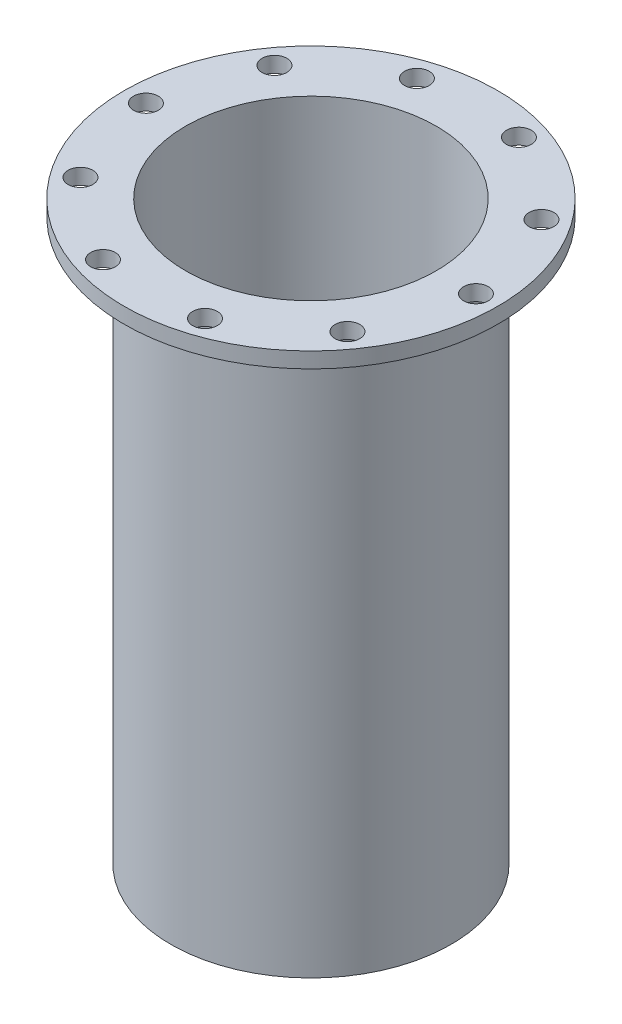
ISO-10303-21;
HEADER;
FILE_DESCRIPTION(('STEP AP214'),'2;1');
FILE_NAME('part.step','',(''),(''),'','','');
FILE_SCHEMA(('AUTOMOTIVE_DESIGN { 1 0 10303 214 1 1 1 1 }'));
ENDSEC;
DATA;
#1=APPLICATION_CONTEXT('core data for automotive mechanical design processes');
#2=APPLICATION_PROTOCOL_DEFINITION('international standard','automotive_design',2000,#1);
#3=PRODUCT_CONTEXT('',#1,'mechanical');
#4=PRODUCT('Part','Part','',(#3));
#5=PRODUCT_RELATED_PRODUCT_CATEGORY('part','',(#4));
#6=PRODUCT_DEFINITION_FORMATION('','',#4);
#7=PRODUCT_DEFINITION_CONTEXT('part definition',#1,'design');
#8=PRODUCT_DEFINITION('design','',#6,#7);
#9=PRODUCT_DEFINITION_SHAPE('','',#8);
#10=(LENGTH_UNIT() NAMED_UNIT(*) SI_UNIT(.MILLI.,.METRE.));
#11=(NAMED_UNIT(*) PLANE_ANGLE_UNIT() SI_UNIT($,.RADIAN.));
#12=(NAMED_UNIT(*) SI_UNIT($,.STERADIAN.) SOLID_ANGLE_UNIT());
#13=UNCERTAINTY_MEASURE_WITH_UNIT(LENGTH_MEASURE(1.E-05),#10,'distance_accuracy_value','');
#14=(GEOMETRIC_REPRESENTATION_CONTEXT(3) GLOBAL_UNCERTAINTY_ASSIGNED_CONTEXT((#13)) GLOBAL_UNIT_ASSIGNED_CONTEXT((#10,
#11,#12)) REPRESENTATION_CONTEXT('',''));
#15=CARTESIAN_POINT('',(0.,0.,0.));
#16=DIRECTION('',(0.,0.,1.));
#17=DIRECTION('',(1.,0.,0.));
#18=AXIS2_PLACEMENT_3D('',#15,#16,#17);
#19=CARTESIAN_POINT('',(76.2,1.25806636316965E-13,0.));
#20=DIRECTION('',(0.,-1.,0.));
#21=DIRECTION('',(1.,0.,0.));
#22=AXIS2_PLACEMENT_3D('',#19,#20,#21);
#23=PLANE('',#22);
#24=CARTESIAN_POINT('',(54.4549338913782,5.66939445869481E-13,39.5638253318057));
#25=DIRECTION('',(0.,1.,0.));
#26=DIRECTION('',(0.,0.,1.));
#27=AXIS2_PLACEMENT_3D('',#24,#25,#26);
#28=CIRCLE('',#27,5.04189999999997);
#29=CARTESIAN_POINT('',(54.4549338913782,5.66939445869481E-13,44.6057253318056));
#30=VERTEX_POINT('',#29);
#31=EDGE_CURVE('E87',#30,#30,#28,.T.);
#32=ORIENTED_EDGE('',*,*,#31,.F.);
#33=EDGE_LOOP('',(#32));
#34=FACE_BOUND('',#33,.T.);
#35=CARTESIAN_POINT('',(20.7999338913784,2.16470374895981E-13,64.0156141118266));
#36=DIRECTION('',(0.,1.,0.));
#37=DIRECTION('',(0.,0.,1.));
#38=AXIS2_PLACEMENT_3D('',#35,#36,#37);
#39=CIRCLE('',#38,5.04189999999997);
#40=CARTESIAN_POINT('',(20.7999338913784,2.16470374895981E-13,69.0575141118265));
#41=VERTEX_POINT('',#40);
#42=EDGE_CURVE('E77',#41,#41,#39,.T.);
#43=ORIENTED_EDGE('',*,*,#42,.F.);
#44=EDGE_LOOP('',(#43));
#45=FACE_BOUND('',#44,.T.);
#46=CARTESIAN_POINT('',(-20.7999338913771,-2.16733220838468E-13,64.015614111827));
#47=DIRECTION('',(0.,1.,0.));
#48=DIRECTION('',(0.,0.,1.));
#49=AXIS2_PLACEMENT_3D('',#46,#47,#48);
#50=CIRCLE('',#49,5.04189999999997);
#51=CARTESIAN_POINT('',(-20.7999338913771,-2.16733220838468E-13,69.0575141118269));
#52=VERTEX_POINT('',#51);
#53=EDGE_CURVE('E74',#52,#52,#50,.T.);
#54=ORIENTED_EDGE('',*,*,#53,.F.);
#55=EDGE_LOOP('',(#54));
#56=FACE_BOUND('',#55,.T.);
#57=CARTESIAN_POINT('',(-54.4549338913774,-5.67202291811973E-13,39.5638253318068));
#58=DIRECTION('',(0.,1.,0.));
#59=DIRECTION('',(0.,0.,1.));
#60=AXIS2_PLACEMENT_3D('',#57,#58,#59);
#61=CIRCLE('',#60,5.04189999999997);
#62=CARTESIAN_POINT('',(-54.4549338913774,-5.67202291811973E-13,44.6057253318068));
#63=VERTEX_POINT('',#62);
#64=EDGE_CURVE('E71',#63,#63,#61,.T.);
#65=ORIENTED_EDGE('',*,*,#64,.F.);
#66=EDGE_LOOP('',(#65));
#67=FACE_BOUND('',#66,.T.);
#68=CARTESIAN_POINT('',(-67.31,-7.01069564918256E-13,0.));
#69=DIRECTION('',(0.,1.,0.));
#70=DIRECTION('',(0.,0.,1.));
#71=AXIS2_PLACEMENT_3D('',#68,#69,#70);
#72=CIRCLE('',#71,5.04189999999997);
#73=CARTESIAN_POINT('',(-67.31,-7.01069564918256E-13,5.04189999999997));
#74=VERTEX_POINT('',#73);
#75=EDGE_CURVE('E70',#74,#74,#72,.T.);
#76=ORIENTED_EDGE('',*,*,#75,.F.);
#77=EDGE_LOOP('',(#76));
#78=FACE_BOUND('',#77,.T.);
#79=CARTESIAN_POINT('',(-54.4549338913779,-5.67202291811979E-13,-39.5638253318061));
#80=DIRECTION('',(0.,1.,0.));
#81=DIRECTION('',(0.,0.,1.));
#82=AXIS2_PLACEMENT_3D('',#79,#80,#81);
#83=CIRCLE('',#82,5.04189999999997);
#84=CARTESIAN_POINT('',(-54.4549338913779,-5.67202291811979E-13,-34.5219253318061));
#85=VERTEX_POINT('',#84);
#86=EDGE_CURVE('E66',#85,#85,#83,.T.);
#87=ORIENTED_EDGE('',*,*,#86,.F.);
#88=EDGE_LOOP('',(#87));
#89=FACE_BOUND('',#88,.T.);
#90=CARTESIAN_POINT('',(-20.799933891378,-2.16733220838477E-13,-64.0156141118267));
#91=DIRECTION('',(0.,1.,0.));
#92=DIRECTION('',(0.,0.,1.));
#93=AXIS2_PLACEMENT_3D('',#90,#91,#92);
#94=CIRCLE('',#93,5.04189999999997);
#95=CARTESIAN_POINT('',(-20.799933891378,-2.16733220838477E-13,-58.9737141118267));
#96=VERTEX_POINT('',#95);
#97=EDGE_CURVE('E65',#96,#96,#94,.T.);
#98=ORIENTED_EDGE('',*,*,#97,.F.);
#99=EDGE_LOOP('',(#98));
#100=FACE_BOUND('',#99,.T.);
#101=CARTESIAN_POINT('',(20.7999338913775,2.16470374895971E-13,-64.0156141118268));
#102=DIRECTION('',(0.,1.,0.));
#103=DIRECTION('',(0.,0.,1.));
#104=AXIS2_PLACEMENT_3D('',#101,#102,#103);
#105=CIRCLE('',#104,5.04189999999997);
#106=CARTESIAN_POINT('',(20.7999338913775,2.16470374895971E-13,-58.9737141118269));
#107=VERTEX_POINT('',#106);
#108=EDGE_CURVE('E104',#107,#107,#105,.T.);
#109=ORIENTED_EDGE('',*,*,#108,.F.);
#110=EDGE_LOOP('',(#109));
#111=FACE_BOUND('',#110,.T.);
#112=CARTESIAN_POINT('',(54.4549338913777,5.66939445869475E-13,-39.5638253318064));
#113=DIRECTION('',(0.,1.,0.));
#114=DIRECTION('',(0.,0.,1.));
#115=AXIS2_PLACEMENT_3D('',#112,#113,#114);
#116=CIRCLE('',#115,5.04189999999997);
#117=CARTESIAN_POINT('',(54.4549338913777,5.66939445869475E-13,-34.5219253318065));
#118=VERTEX_POINT('',#117);
#119=EDGE_CURVE('E61',#118,#118,#116,.T.);
#120=ORIENTED_EDGE('',*,*,#119,.F.);
#121=EDGE_LOOP('',(#120));
#122=FACE_BOUND('',#121,.T.);
#123=CARTESIAN_POINT('',(67.31,7.00806718975755E-13,0.));
#124=DIRECTION('',(0.,1.,0.));
#125=DIRECTION('',(0.,0.,1.));
#126=AXIS2_PLACEMENT_3D('',#123,#124,#125);
#127=CIRCLE('',#126,5.04189999999997);
#128=CARTESIAN_POINT('',(67.31,7.00806718975755E-13,5.04189999999997));
#129=VERTEX_POINT('',#128);
#130=EDGE_CURVE('E57',#129,#129,#127,.T.);
#131=ORIENTED_EDGE('',*,*,#130,.F.);
#132=EDGE_LOOP('',(#131));
#133=FACE_BOUND('',#132,.T.);
#134=CARTESIAN_POINT('',(0.,-5.38710126497475E-13,0.));
#135=DIRECTION('',(0.,1.,0.));
#136=DIRECTION('',(-1.,0.,0.));
#137=AXIS2_PLACEMENT_3D('',#134,#135,#136);
#138=CIRCLE('',#137,51.1302);
#139=CARTESIAN_POINT('',(-51.1302,-1.07115860941797E-12,0.));
#140=VERTEX_POINT('',#139);
#141=EDGE_CURVE('E10',#140,#140,#138,.T.);
#142=ORIENTED_EDGE('',*,*,#141,.F.);
#143=EDGE_LOOP('',(#142));
#144=FACE_BOUND('',#143,.T.);
#145=CARTESIAN_POINT('',(0.,-7.96706356220305E-13,0.));
#146=DIRECTION('',(0.,1.,0.));
#147=DIRECTION('',(-1.,0.,0.));
#148=AXIS2_PLACEMENT_3D('',#145,#146,#147);
#149=CIRCLE('',#148,76.2);
#150=CARTESIAN_POINT('',(-76.2,-1.59022123389616E-12,0.));
#151=VERTEX_POINT('',#150);
#152=EDGE_CURVE('E56',#151,#151,#149,.T.);
#153=ORIENTED_EDGE('',*,*,#152,.T.);
#154=EDGE_LOOP('',(#153));
#155=FACE_BOUND('',#154,.T.);
#156=ADVANCED_FACE('F37',(#34,#45,#56,#67,#78,#89,#100,#111,#122,#133,#144,#155),#23,.F.);
#157=CARTESIAN_POINT('',(0.,0.,0.));
#158=DIRECTION('',(0.,1.,0.));
#159=DIRECTION('',(-1.,0.,0.));
#160=AXIS2_PLACEMENT_3D('',#157,#158,#159);
#161=CYLINDRICAL_SURFACE('',#160,51.1301999999989);
#162=CARTESIAN_POINT('',(2.22845428147304E-12,-213.995000000001,0.));
#163=DIRECTION('',(0.,1.,0.));
#164=DIRECTION('',(-1.,0.,0.));
#165=AXIS2_PLACEMENT_3D('',#162,#163,#164);
#166=CIRCLE('',#165,51.1301999999978);
#167=CARTESIAN_POINT('',(-51.1301999999956,-213.995000000002,0.));
#168=VERTEX_POINT('',#167);
#169=EDGE_CURVE('E44',#168,#168,#166,.T.);
#170=ORIENTED_EDGE('',*,*,#169,.F.);
#171=EDGE_LOOP('',(#170));
#172=FACE_BOUND('',#171,.T.);
#173=ORIENTED_EDGE('',*,*,#141,.T.);
#174=EDGE_LOOP('',(#173));
#175=FACE_BOUND('',#174,.T.);
#176=ADVANCED_FACE('F141',(#172,#175),#161,.F.);
#177=CARTESIAN_POINT('',(51.1302,-213.995000000001,0.));
#178=DIRECTION('',(0.,1.,0.));
#179=DIRECTION('',(-1.,0.,0.));
#180=AXIS2_PLACEMENT_3D('',#177,#178,#179);
#181=PLANE('',#180);
#182=CARTESIAN_POINT('',(2.22845428147304E-12,-213.995000000001,0.));
#183=DIRECTION('',(0.,1.,0.));
#184=DIRECTION('',(-1.,0.,0.));
#185=AXIS2_PLACEMENT_3D('',#182,#183,#184);
#186=CIRCLE('',#185,53.6701999999978);
#187=CARTESIAN_POINT('',(-53.6701999999956,-213.995000000002,0.));
#188=VERTEX_POINT('',#187);
#189=EDGE_CURVE('E49',#188,#188,#186,.T.);
#190=ORIENTED_EDGE('',*,*,#189,.F.);
#191=EDGE_LOOP('',(#190));
#192=FACE_BOUND('',#191,.T.);
#193=ORIENTED_EDGE('',*,*,#169,.T.);
#194=EDGE_LOOP('',(#193));
#195=FACE_BOUND('',#194,.T.);
#196=ADVANCED_FACE('F138',(#192,#195),#181,.F.);
#197=CARTESIAN_POINT('',(0.,0.,0.));
#198=DIRECTION('',(0.,1.,0.));
#199=DIRECTION('',(-1.,0.,0.));
#200=AXIS2_PLACEMENT_3D('',#197,#198,#199);
#201=CYLINDRICAL_SURFACE('',#200,53.6701999999978);
#202=CARTESIAN_POINT('',(2.26019487658007E-12,-217.043000000001,0.));
#203=DIRECTION('',(0.,1.,0.));
#204=DIRECTION('',(-1.,0.,0.));
#205=AXIS2_PLACEMENT_3D('',#202,#203,#204);
#206=CIRCLE('',#205,53.6701999999978);
#207=CARTESIAN_POINT('',(-53.6701999999955,-217.043000000002,0.));
#208=VERTEX_POINT('',#207);
#209=EDGE_CURVE('E131',#208,#208,#206,.T.);
#210=ORIENTED_EDGE('',*,*,#209,.F.);
#211=EDGE_LOOP('',(#210));
#212=FACE_BOUND('',#211,.T.);
#213=ORIENTED_EDGE('',*,*,#189,.T.);
#214=EDGE_LOOP('',(#213));
#215=FACE_BOUND('',#214,.T.);
#216=ADVANCED_FACE('F136',(#212,#215),#201,.F.);
#217=CARTESIAN_POINT('',(53.6702,-217.043000000001,0.));
#218=DIRECTION('',(0.,-1.,0.));
#219=DIRECTION('',(1.,0.,0.));
#220=AXIS2_PLACEMENT_3D('',#217,#218,#219);
#221=PLANE('',#220);
#222=CARTESIAN_POINT('',(2.26019487658007E-12,-217.043000000001,0.));
#223=DIRECTION('',(0.,1.,0.));
#224=DIRECTION('',(-1.,0.,0.));
#225=AXIS2_PLACEMENT_3D('',#222,#223,#224);
#226=CIRCLE('',#225,51.1301999999978);
#227=CARTESIAN_POINT('',(-51.1301999999955,-217.043000000002,0.));
#228=VERTEX_POINT('',#227);
#229=EDGE_CURVE('E128',#228,#228,#226,.T.);
#230=ORIENTED_EDGE('',*,*,#229,.F.);
#231=EDGE_LOOP('',(#230));
#232=FACE_BOUND('',#231,.T.);
#233=ORIENTED_EDGE('',*,*,#209,.T.);
#234=EDGE_LOOP('',(#233));
#235=FACE_BOUND('',#234,.T.);
#236=ADVANCED_FACE('F153',(#232,#235),#221,.F.);
#237=CARTESIAN_POINT('',(0.,0.,0.));
#238=DIRECTION('',(0.,1.,0.));
#239=DIRECTION('',(-1.,0.,0.));
#240=AXIS2_PLACEMENT_3D('',#237,#238,#239);
#241=CYLINDRICAL_SURFACE('',#240,51.1301999999977);
#242=CARTESIAN_POINT('',(2.44667087283389E-12,-234.950000000001,0.));
#243=DIRECTION('',(0.,1.,0.));
#244=DIRECTION('',(-1.,0.,0.));
#245=AXIS2_PLACEMENT_3D('',#242,#243,#244);
#246=CIRCLE('',#245,51.1301999999976);
#247=CARTESIAN_POINT('',(-51.1301999999951,-234.950000000001,0.));
#248=VERTEX_POINT('',#247);
#249=EDGE_CURVE('E125',#248,#248,#246,.T.);
#250=ORIENTED_EDGE('',*,*,#249,.F.);
#251=EDGE_LOOP('',(#250));
#252=FACE_BOUND('',#251,.T.);
#253=ORIENTED_EDGE('',*,*,#229,.T.);
#254=EDGE_LOOP('',(#253));
#255=FACE_BOUND('',#254,.T.);
#256=ADVANCED_FACE('F157',(#252,#255),#241,.F.);
#257=CARTESIAN_POINT('',(51.1302,-234.95,0.));
#258=DIRECTION('',(0.,1.,0.));
#259=DIRECTION('',(-1.,0.,0.));
#260=AXIS2_PLACEMENT_3D('',#257,#258,#259);
#261=PLANE('',#260);
#262=CARTESIAN_POINT('',(2.44667087283389E-12,-234.950000000001,0.));
#263=DIRECTION('',(0.,1.,0.));
#264=DIRECTION('',(-1.,0.,0.));
#265=AXIS2_PLACEMENT_3D('',#262,#263,#264);
#266=CIRCLE('',#265,57.1499999999976);
#267=CARTESIAN_POINT('',(-57.1499999999951,-234.950000000001,0.));
#268=VERTEX_POINT('',#267);
#269=EDGE_CURVE('E122',#268,#268,#266,.T.);
#270=ORIENTED_EDGE('',*,*,#269,.F.);
#271=EDGE_LOOP('',(#270));
#272=FACE_BOUND('',#271,.T.);
#273=ORIENTED_EDGE('',*,*,#249,.T.);
#274=EDGE_LOOP('',(#273));
#275=FACE_BOUND('',#274,.T.);
#276=ADVANCED_FACE('F161',(#272,#275),#261,.F.);
#277=CARTESIAN_POINT('',(0.,0.,0.));
#278=DIRECTION('',(0.,1.,0.));
#279=DIRECTION('',(-1.,0.,0.));
#280=AXIS2_PLACEMENT_3D('',#277,#278,#279);
#281=CYLINDRICAL_SURFACE('',#280,57.1499999999988);
#282=CARTESIAN_POINT('',(0.,-6.3500000000006,0.));
#283=DIRECTION('',(0.,1.,0.));
#284=DIRECTION('',(-1.,0.,0.));
#285=AXIS2_PLACEMENT_3D('',#282,#283,#284);
#286=CIRCLE('',#285,57.1499999999999);
#287=CARTESIAN_POINT('',(-57.1499999999999,-6.35000000000119,0.));
#288=VERTEX_POINT('',#287);
#289=EDGE_CURVE('E119',#288,#288,#286,.T.);
#290=ORIENTED_EDGE('',*,*,#289,.F.);
#291=EDGE_LOOP('',(#290));
#292=FACE_BOUND('',#291,.T.);
#293=ORIENTED_EDGE('',*,*,#269,.T.);
#294=EDGE_LOOP('',(#293));
#295=FACE_BOUND('',#294,.T.);
#296=ADVANCED_FACE('F165',(#292,#295),#281,.T.);
#297=CARTESIAN_POINT('',(57.15,-6.3500000000001,0.));
#298=DIRECTION('',(0.,1.,0.));
#299=DIRECTION('',(-1.,0.,0.));
#300=AXIS2_PLACEMENT_3D('',#297,#298,#299);
#301=PLANE('',#300);
#302=CARTESIAN_POINT('',(54.4549338913782,-6.35000000000013,39.5638253318057));
#303=DIRECTION('',(0.,1.,0.));
#304=DIRECTION('',(-1.,0.,0.));
#305=AXIS2_PLACEMENT_3D('',#302,#303,#304);
#306=CIRCLE('',#305,5.04189999999995);
#307=CARTESIAN_POINT('',(49.4130338913783,-6.35000000000018,39.5638253318057));
#308=VERTEX_POINT('',#307);
#309=EDGE_CURVE('E40',#308,#308,#306,.T.);
#310=ORIENTED_EDGE('',*,*,#309,.T.);
#311=EDGE_LOOP('',(#310));
#312=FACE_BOUND('',#311,.T.);
#313=CARTESIAN_POINT('',(20.7999338913784,-6.35000000000048,64.0156141118266));
#314=DIRECTION('',(0.,1.,0.));
#315=DIRECTION('',(-1.,0.,0.));
#316=AXIS2_PLACEMENT_3D('',#313,#314,#315);
#317=CIRCLE('',#316,5.04189999999995);
#318=CARTESIAN_POINT('',(15.7580338913785,-6.35000000000053,64.0156141118266));
#319=VERTEX_POINT('',#318);
#320=EDGE_CURVE('E75',#319,#319,#317,.T.);
#321=ORIENTED_EDGE('',*,*,#320,.T.);
#322=EDGE_LOOP('',(#321));
#323=FACE_BOUND('',#322,.T.);
#324=CARTESIAN_POINT('',(-20.7999338913771,-6.35000000000091,64.015614111827));
#325=DIRECTION('',(0.,1.,0.));
#326=DIRECTION('',(-1.,0.,0.));
#327=AXIS2_PLACEMENT_3D('',#324,#325,#326);
#328=CIRCLE('',#327,5.04189999999995);
#329=CARTESIAN_POINT('',(-25.841833891377,-6.35000000000097,64.015614111827));
#330=VERTEX_POINT('',#329);
#331=EDGE_CURVE('E72',#330,#330,#328,.T.);
#332=ORIENTED_EDGE('',*,*,#331,.T.);
#333=EDGE_LOOP('',(#332));
#334=FACE_BOUND('',#333,.T.);
#335=CARTESIAN_POINT('',(-54.4549338913774,-6.35000000000126,39.5638253318068));
#336=DIRECTION('',(0.,1.,0.));
#337=DIRECTION('',(-1.,0.,0.));
#338=AXIS2_PLACEMENT_3D('',#335,#336,#337);
#339=CIRCLE('',#338,5.04189999999995);
#340=CARTESIAN_POINT('',(-59.4968338913773,-6.35000000000132,39.5638253318068));
#341=VERTEX_POINT('',#340);
#342=EDGE_CURVE('E67',#341,#341,#339,.T.);
#343=ORIENTED_EDGE('',*,*,#342,.T.);
#344=EDGE_LOOP('',(#343));
#345=FACE_BOUND('',#344,.T.);
#346=CARTESIAN_POINT('',(-67.31,-6.3500000000014,0.));
#347=DIRECTION('',(0.,1.,0.));
#348=DIRECTION('',(-1.,0.,0.));
#349=AXIS2_PLACEMENT_3D('',#346,#347,#348);
#350=CIRCLE('',#349,5.04189999999995);
#351=CARTESIAN_POINT('',(-72.3518999999999,-6.35000000000145,0.));
#352=VERTEX_POINT('',#351);
#353=EDGE_CURVE('E94',#352,#352,#350,.T.);
#354=ORIENTED_EDGE('',*,*,#353,.T.);
#355=EDGE_LOOP('',(#354));
#356=FACE_BOUND('',#355,.T.);
#357=CARTESIAN_POINT('',(-54.4549338913779,-6.35000000000126,-39.5638253318061));
#358=DIRECTION('',(0.,1.,0.));
#359=DIRECTION('',(-1.,0.,0.));
#360=AXIS2_PLACEMENT_3D('',#357,#358,#359);
#361=CIRCLE('',#360,5.04189999999995);
#362=CARTESIAN_POINT('',(-59.4968338913779,-6.35000000000132,-39.5638253318061));
#363=VERTEX_POINT('',#362);
#364=EDGE_CURVE('E62',#363,#363,#361,.T.);
#365=ORIENTED_EDGE('',*,*,#364,.T.);
#366=EDGE_LOOP('',(#365));
#367=FACE_BOUND('',#366,.T.);
#368=CARTESIAN_POINT('',(-20.799933891378,-6.35000000000091,-64.0156141118267));
#369=DIRECTION('',(0.,1.,0.));
#370=DIRECTION('',(-1.,0.,0.));
#371=AXIS2_PLACEMENT_3D('',#368,#369,#370);
#372=CIRCLE('',#371,5.04189999999995);
#373=CARTESIAN_POINT('',(-25.8418338913779,-6.35000000000097,-64.0156141118267));
#374=VERTEX_POINT('',#373);
#375=EDGE_CURVE('E101',#374,#374,#372,.T.);
#376=ORIENTED_EDGE('',*,*,#375,.T.);
#377=EDGE_LOOP('',(#376));
#378=FACE_BOUND('',#377,.T.);
#379=CARTESIAN_POINT('',(20.7999338913775,-6.35000000000048,-64.0156141118268));
#380=DIRECTION('',(0.,1.,0.));
#381=DIRECTION('',(-1.,0.,0.));
#382=AXIS2_PLACEMENT_3D('',#379,#380,#381);
#383=CIRCLE('',#382,5.04189999999995);
#384=CARTESIAN_POINT('',(15.7580338913776,-6.35000000000053,-64.0156141118268));
#385=VERTEX_POINT('',#384);
#386=EDGE_CURVE('E107',#385,#385,#383,.T.);
#387=ORIENTED_EDGE('',*,*,#386,.T.);
#388=EDGE_LOOP('',(#387));
#389=FACE_BOUND('',#388,.T.);
#390=CARTESIAN_POINT('',(54.4549338913777,-6.35000000000013,-39.5638253318064));
#391=DIRECTION('',(0.,1.,0.));
#392=DIRECTION('',(-1.,0.,0.));
#393=AXIS2_PLACEMENT_3D('',#390,#391,#392);
#394=CIRCLE('',#393,5.04189999999995);
#395=CARTESIAN_POINT('',(49.4130338913777,-6.35000000000018,-39.5638253318064));
#396=VERTEX_POINT('',#395);
#397=EDGE_CURVE('E58',#396,#396,#394,.T.);
#398=ORIENTED_EDGE('',*,*,#397,.T.);
#399=EDGE_LOOP('',(#398));
#400=FACE_BOUND('',#399,.T.);
#401=CARTESIAN_POINT('',(67.31,-6.35,0.));
#402=DIRECTION('',(0.,1.,0.));
#403=DIRECTION('',(-1.,0.,0.));
#404=AXIS2_PLACEMENT_3D('',#401,#402,#403);
#405=CIRCLE('',#404,5.04189999999996);
#406=CARTESIAN_POINT('',(62.2681,-6.35000000000005,0.));
#407=VERTEX_POINT('',#406);
#408=EDGE_CURVE('E53',#407,#407,#405,.T.);
#409=ORIENTED_EDGE('',*,*,#408,.T.);
#410=EDGE_LOOP('',(#409));
#411=FACE_BOUND('',#410,.T.);
#412=CARTESIAN_POINT('',(0.,-6.3500000000008,0.));
#413=DIRECTION('',(0.,1.,0.));
#414=DIRECTION('',(-1.,0.,0.));
#415=AXIS2_PLACEMENT_3D('',#412,#413,#414);
#416=CIRCLE('',#415,76.1999999999999);
#417=CARTESIAN_POINT('',(-76.1999999999999,-6.35000000000159,0.));
#418=VERTEX_POINT('',#417);
#419=EDGE_CURVE('E116',#418,#418,#416,.T.);
#420=ORIENTED_EDGE('',*,*,#419,.F.);
#421=EDGE_LOOP('',(#420));
#422=FACE_BOUND('',#421,.T.);
#423=ORIENTED_EDGE('',*,*,#289,.T.);
#424=EDGE_LOOP('',(#423));
#425=FACE_BOUND('',#424,.T.);
#426=ADVANCED_FACE('F169',(#312,#323,#334,#345,#356,#367,#378,#389,#400,#411,#422,#425),#301,.F.);
#427=CARTESIAN_POINT('',(0.,0.,0.));
#428=DIRECTION('',(0.,1.,0.));
#429=DIRECTION('',(-1.,0.,0.));
#430=AXIS2_PLACEMENT_3D('',#427,#428,#429);
#431=CYLINDRICAL_SURFACE('',#430,76.2);
#432=ORIENTED_EDGE('',*,*,#152,.F.);
#433=EDGE_LOOP('',(#432));
#434=FACE_BOUND('',#433,.T.);
#435=ORIENTED_EDGE('',*,*,#419,.T.);
#436=EDGE_LOOP('',(#435));
#437=FACE_BOUND('',#436,.T.);
#438=ADVANCED_FACE('F173',(#434,#437),#431,.T.);
#439=CARTESIAN_POINT('',(67.31,7.00938141947005E-13,0.));
#440=DIRECTION('',(0.,1.,0.));
#441=DIRECTION('',(0.,0.,1.));
#442=AXIS2_PLACEMENT_3D('',#439,#440,#441);
#443=CYLINDRICAL_SURFACE('',#442,5.04189999999996);
#444=ORIENTED_EDGE('',*,*,#130,.T.);
#445=EDGE_LOOP('',(#444));
#446=FACE_BOUND('',#445,.T.);
#447=ORIENTED_EDGE('',*,*,#408,.F.);
#448=EDGE_LOOP('',(#447));
#449=FACE_BOUND('',#448,.T.);
#450=ADVANCED_FACE('F177',(#446,#449),#443,.F.);
#451=CARTESIAN_POINT('',(54.4549338913777,5.67070868840726E-13,-39.5638253318064));
#452=DIRECTION('',(0.,1.,0.));
#453=DIRECTION('',(0.,0.,1.));
#454=AXIS2_PLACEMENT_3D('',#451,#452,#453);
#455=CYLINDRICAL_SURFACE('',#454,5.04189999999995);
#456=ORIENTED_EDGE('',*,*,#119,.T.);
#457=EDGE_LOOP('',(#456));
#458=FACE_BOUND('',#457,.T.);
#459=ORIENTED_EDGE('',*,*,#397,.F.);
#460=EDGE_LOOP('',(#459));
#461=FACE_BOUND('',#460,.T.);
#462=ADVANCED_FACE('F181',(#458,#461),#455,.F.);
#463=CARTESIAN_POINT('',(20.7999338913775,2.16601797867222E-13,-64.0156141118268));
#464=DIRECTION('',(0.,1.,0.));
#465=DIRECTION('',(0.,0.,1.));
#466=AXIS2_PLACEMENT_3D('',#463,#464,#465);
#467=CYLINDRICAL_SURFACE('',#466,5.04189999999995);
#468=ORIENTED_EDGE('',*,*,#108,.T.);
#469=EDGE_LOOP('',(#468));
#470=FACE_BOUND('',#469,.T.);
#471=ORIENTED_EDGE('',*,*,#386,.F.);
#472=EDGE_LOOP('',(#471));
#473=FACE_BOUND('',#472,.T.);
#474=ADVANCED_FACE('F185',(#470,#473),#467,.F.);
#475=CARTESIAN_POINT('',(-20.799933891378,-2.16601797867227E-13,-64.0156141118267));
#476=DIRECTION('',(0.,1.,0.));
#477=DIRECTION('',(0.,0.,1.));
#478=AXIS2_PLACEMENT_3D('',#475,#476,#477);
#479=CYLINDRICAL_SURFACE('',#478,5.04189999999995);
#480=ORIENTED_EDGE('',*,*,#97,.T.);
#481=EDGE_LOOP('',(#480));
#482=FACE_BOUND('',#481,.T.);
#483=ORIENTED_EDGE('',*,*,#375,.F.);
#484=EDGE_LOOP('',(#483));
#485=FACE_BOUND('',#484,.T.);
#486=ADVANCED_FACE('F189',(#482,#485),#479,.F.);
#487=CARTESIAN_POINT('',(-54.4549338913779,-5.67070868840729E-13,-39.5638253318061));
#488=DIRECTION('',(0.,1.,0.));
#489=DIRECTION('',(0.,0.,1.));
#490=AXIS2_PLACEMENT_3D('',#487,#488,#489);
#491=CYLINDRICAL_SURFACE('',#490,5.04189999999995);
#492=ORIENTED_EDGE('',*,*,#86,.T.);
#493=EDGE_LOOP('',(#492));
#494=FACE_BOUND('',#493,.T.);
#495=ORIENTED_EDGE('',*,*,#364,.F.);
#496=EDGE_LOOP('',(#495));
#497=FACE_BOUND('',#496,.T.);
#498=ADVANCED_FACE('F193',(#494,#497),#491,.F.);
#499=CARTESIAN_POINT('',(-67.31,-7.00938141947005E-13,0.));
#500=DIRECTION('',(0.,1.,0.));
#501=DIRECTION('',(0.,0.,1.));
#502=AXIS2_PLACEMENT_3D('',#499,#500,#501);
#503=CYLINDRICAL_SURFACE('',#502,5.04189999999995);
#504=ORIENTED_EDGE('',*,*,#75,.T.);
#505=EDGE_LOOP('',(#504));
#506=FACE_BOUND('',#505,.T.);
#507=ORIENTED_EDGE('',*,*,#353,.F.);
#508=EDGE_LOOP('',(#507));
#509=FACE_BOUND('',#508,.T.);
#510=ADVANCED_FACE('F197',(#506,#509),#503,.F.);
#511=CARTESIAN_POINT('',(-54.4549338913774,-5.67070868840723E-13,39.5638253318068));
#512=DIRECTION('',(0.,1.,0.));
#513=DIRECTION('',(0.,0.,1.));
#514=AXIS2_PLACEMENT_3D('',#511,#512,#513);
#515=CYLINDRICAL_SURFACE('',#514,5.04189999999995);
#516=ORIENTED_EDGE('',*,*,#64,.T.);
#517=EDGE_LOOP('',(#516));
#518=FACE_BOUND('',#517,.T.);
#519=ORIENTED_EDGE('',*,*,#342,.F.);
#520=EDGE_LOOP('',(#519));
#521=FACE_BOUND('',#520,.T.);
#522=ADVANCED_FACE('F201',(#518,#521),#515,.F.);
#523=CARTESIAN_POINT('',(-20.7999338913771,-2.16601797867217E-13,64.015614111827));
#524=DIRECTION('',(0.,1.,0.));
#525=DIRECTION('',(0.,0.,1.));
#526=AXIS2_PLACEMENT_3D('',#523,#524,#525);
#527=CYLINDRICAL_SURFACE('',#526,5.04189999999995);
#528=ORIENTED_EDGE('',*,*,#53,.T.);
#529=EDGE_LOOP('',(#528));
#530=FACE_BOUND('',#529,.T.);
#531=ORIENTED_EDGE('',*,*,#331,.F.);
#532=EDGE_LOOP('',(#531));
#533=FACE_BOUND('',#532,.T.);
#534=ADVANCED_FACE('F205',(#530,#533),#527,.F.);
#535=CARTESIAN_POINT('',(20.7999338913784,2.16601797867231E-13,64.0156141118266));
#536=DIRECTION('',(0.,1.,0.));
#537=DIRECTION('',(0.,0.,1.));
#538=AXIS2_PLACEMENT_3D('',#535,#536,#537);
#539=CYLINDRICAL_SURFACE('',#538,5.04189999999995);
#540=ORIENTED_EDGE('',*,*,#42,.T.);
#541=EDGE_LOOP('',(#540));
#542=FACE_BOUND('',#541,.T.);
#543=ORIENTED_EDGE('',*,*,#320,.F.);
#544=EDGE_LOOP('',(#543));
#545=FACE_BOUND('',#544,.T.);
#546=ADVANCED_FACE('F209',(#542,#545),#539,.F.);
#547=CARTESIAN_POINT('',(54.4549338913782,5.67070868840732E-13,39.5638253318057));
#548=DIRECTION('',(0.,1.,0.));
#549=DIRECTION('',(0.,0.,1.));
#550=AXIS2_PLACEMENT_3D('',#547,#548,#549);
#551=CYLINDRICAL_SURFACE('',#550,5.04189999999995);
#552=ORIENTED_EDGE('',*,*,#31,.T.);
#553=EDGE_LOOP('',(#552));
#554=FACE_BOUND('',#553,.T.);
#555=ORIENTED_EDGE('',*,*,#309,.F.);
#556=EDGE_LOOP('',(#555));
#557=FACE_BOUND('',#556,.T.);
#558=ADVANCED_FACE('F213',(#554,#557),#551,.F.);
#559=CLOSED_SHELL('',(#156,#176,#196,#216,#236,#256,#276,#296,#426,#438,#450,#462,#474,#486,
#498,#510,#522,#534,#546,#558));
#560=MANIFOLD_SOLID_BREP('B2',#559);
#561=ADVANCED_BREP_SHAPE_REPRESENTATION('',(#18,#560),#14);
#562=SHAPE_DEFINITION_REPRESENTATION(#9,#561);
ENDSEC;
END-ISO-10303-21;
